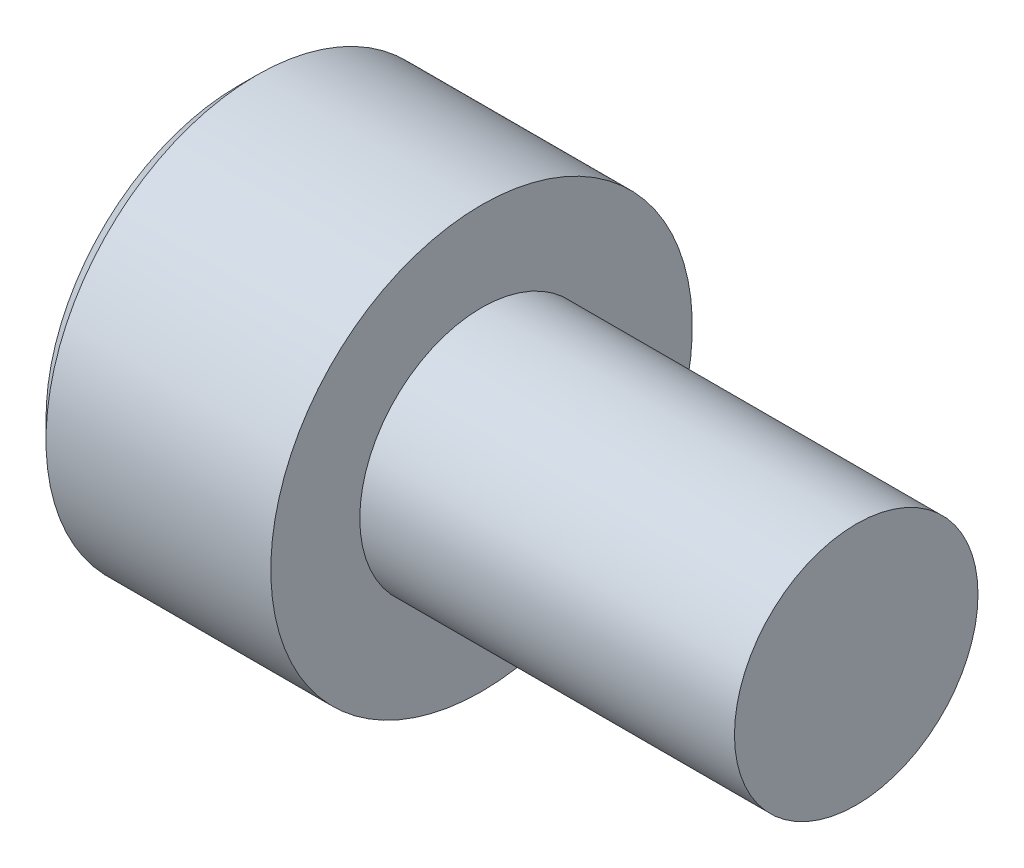
ISO-10303-21;
HEADER;
FILE_DESCRIPTION(('STEP AP214'),'2;1');
FILE_NAME('part.step','',(''),(''),'','','');
FILE_SCHEMA(('AUTOMOTIVE_DESIGN { 1 0 10303 214 1 1 1 1 }'));
ENDSEC;
DATA;
#1=APPLICATION_CONTEXT('core data for automotive mechanical design processes');
#2=APPLICATION_PROTOCOL_DEFINITION('international standard','automotive_design',2000,#1);
#3=PRODUCT_CONTEXT('',#1,'mechanical');
#4=PRODUCT('Part','Part','',(#3));
#5=PRODUCT_RELATED_PRODUCT_CATEGORY('part','',(#4));
#6=PRODUCT_DEFINITION_FORMATION('','',#4);
#7=PRODUCT_DEFINITION_CONTEXT('part definition',#1,'design');
#8=PRODUCT_DEFINITION('design','',#6,#7);
#9=PRODUCT_DEFINITION_SHAPE('','',#8);
#10=(LENGTH_UNIT() NAMED_UNIT(*) SI_UNIT(.MILLI.,.METRE.));
#11=(NAMED_UNIT(*) PLANE_ANGLE_UNIT() SI_UNIT($,.RADIAN.));
#12=(NAMED_UNIT(*) SI_UNIT($,.STERADIAN.) SOLID_ANGLE_UNIT());
#13=UNCERTAINTY_MEASURE_WITH_UNIT(LENGTH_MEASURE(1.E-05),#10,'distance_accuracy_value','');
#14=(GEOMETRIC_REPRESENTATION_CONTEXT(3) GLOBAL_UNCERTAINTY_ASSIGNED_CONTEXT((#13)) GLOBAL_UNIT_ASSIGNED_CONTEXT((#10,
#11,#12)) REPRESENTATION_CONTEXT('',''));
#15=CARTESIAN_POINT('',(0.,0.,0.));
#16=DIRECTION('',(0.,0.,1.));
#17=DIRECTION('',(1.,0.,0.));
#18=AXIS2_PLACEMENT_3D('',#15,#16,#17);
#19=CARTESIAN_POINT('',(-2.6,0.,0.));
#20=DIRECTION('',(1.,0.,0.));
#21=DIRECTION('',(0.,1.,0.));
#22=AXIS2_PLACEMENT_3D('',#19,#20,#21);
#23=PLANE('',#22);
#24=CARTESIAN_POINT('',(-2.6,0.,0.));
#25=DIRECTION('',(1.,0.,0.));
#26=DIRECTION('',(0.,1.,0.));
#27=AXIS2_PLACEMENT_3D('',#24,#25,#26);
#28=CIRCLE('',#27,2.05);
#29=CARTESIAN_POINT('',(-2.6,2.05,0.));
#30=VERTEX_POINT('',#29);
#31=EDGE_CURVE('E53',#30,#30,#28,.F.);
#32=ORIENTED_EDGE('',*,*,#31,.T.);
#33=EDGE_LOOP('',(#32));
#34=FACE_BOUND('',#33,.T.);
#35=DIRECTION('',(0.,0.5,-0.866025403784439));
#36=VECTOR('',#35,1.);
#37=CARTESIAN_POINT('',(-2.6,0.577350269189626,1.));
#38=LINE('',#37,#36);
#39=CARTESIAN_POINT('',(-2.6,0.577350269189626,1.));
#40=VERTEX_POINT('',#39);
#41=CARTESIAN_POINT('',(-2.6,1.15470053837925,0.));
#42=VERTEX_POINT('',#41);
#43=EDGE_CURVE('E189',#40,#42,#38,.T.);
#44=ORIENTED_EDGE('',*,*,#43,.F.);
#45=DIRECTION('',(0.,1.,0.));
#46=VECTOR('',#45,1.);
#47=CARTESIAN_POINT('',(-2.6,-0.577350269189626,1.));
#48=LINE('',#47,#46);
#49=CARTESIAN_POINT('',(-2.6,-0.577350269189626,1.));
#50=VERTEX_POINT('',#49);
#51=EDGE_CURVE('E151',#50,#40,#48,.T.);
#52=ORIENTED_EDGE('',*,*,#51,.F.);
#53=DIRECTION('',(0.,0.5,0.866025403784439));
#54=VECTOR('',#53,1.);
#55=CARTESIAN_POINT('',(-2.6,-1.15470053837925,0.));
#56=LINE('',#55,#54);
#57=CARTESIAN_POINT('',(-2.6,-1.15470053837925,0.));
#58=VERTEX_POINT('',#57);
#59=EDGE_CURVE('E147',#58,#50,#56,.T.);
#60=ORIENTED_EDGE('',*,*,#59,.F.);
#61=DIRECTION('',(0.,-0.5,0.866025403784439));
#62=VECTOR('',#61,1.);
#63=CARTESIAN_POINT('',(-2.6,-0.577350269189626,-1.));
#64=LINE('',#63,#62);
#65=CARTESIAN_POINT('',(-2.6,-0.577350269189626,-1.));
#66=VERTEX_POINT('',#65);
#67=EDGE_CURVE('E198',#66,#58,#64,.T.);
#68=ORIENTED_EDGE('',*,*,#67,.F.);
#69=DIRECTION('',(0.,-1.,0.));
#70=VECTOR('',#69,1.);
#71=CARTESIAN_POINT('',(-2.6,0.577350269189626,-1.));
#72=LINE('',#71,#70);
#73=CARTESIAN_POINT('',(-2.6,0.577350269189626,-1.));
#74=VERTEX_POINT('',#73);
#75=EDGE_CURVE('E195',#74,#66,#72,.T.);
#76=ORIENTED_EDGE('',*,*,#75,.F.);
#77=DIRECTION('',(0.,-0.5,-0.866025403784439));
#78=VECTOR('',#77,1.);
#79=CARTESIAN_POINT('',(-2.6,1.15470053837925,0.));
#80=LINE('',#79,#78);
#81=EDGE_CURVE('E192',#42,#74,#80,.T.);
#82=ORIENTED_EDGE('',*,*,#81,.F.);
#83=EDGE_LOOP('',(#44,#52,#60,#68,#76,#82));
#84=FACE_BOUND('',#83,.T.);
#85=ADVANCED_FACE('F44',(#34,#84),#23,.F.);
#86=CARTESIAN_POINT('',(0.,1.3,0.));
#87=DIRECTION('',(-1.,0.,0.));
#88=DIRECTION('',(0.,-1.,0.));
#89=AXIS2_PLACEMENT_3D('',#86,#87,#88);
#90=PLANE('',#89);
#91=CARTESIAN_POINT('',(0.,0.,0.));
#92=DIRECTION('',(-1.,0.,0.));
#93=DIRECTION('',(0.,-1.,0.));
#94=AXIS2_PLACEMENT_3D('',#91,#92,#93);
#95=CIRCLE('',#94,2.25);
#96=CARTESIAN_POINT('',(0.,-2.25,0.));
#97=VERTEX_POINT('',#96);
#98=EDGE_CURVE('E233',#97,#97,#95,.T.);
#99=ORIENTED_EDGE('',*,*,#98,.F.);
#100=EDGE_LOOP('',(#99));
#101=FACE_BOUND('',#100,.T.);
#102=CARTESIAN_POINT('',(0.,0.,0.));
#103=DIRECTION('',(-1.,0.,0.));
#104=DIRECTION('',(0.,-1.,0.));
#105=AXIS2_PLACEMENT_3D('',#102,#103,#104);
#106=CIRCLE('',#105,1.3);
#107=CARTESIAN_POINT('',(0.,-1.3,0.));
#108=VERTEX_POINT('',#107);
#109=EDGE_CURVE('E226',#108,#108,#106,.T.);
#110=ORIENTED_EDGE('',*,*,#109,.T.);
#111=EDGE_LOOP('',(#110));
#112=FACE_BOUND('',#111,.T.);
#113=ADVANCED_FACE('F254',(#101,#112),#90,.F.);
#114=CARTESIAN_POINT('',(-2.6,0.,0.));
#115=DIRECTION('',(-1.,0.,0.));
#116=DIRECTION('',(0.,-1.,0.));
#117=AXIS2_PLACEMENT_3D('',#114,#115,#116);
#118=CYLINDRICAL_SURFACE('',#117,2.25);
#119=CARTESIAN_POINT('',(-2.4,0.,0.));
#120=DIRECTION('',(1.,0.,0.));
#121=DIRECTION('',(0.,1.,0.));
#122=AXIS2_PLACEMENT_3D('',#119,#120,#121);
#123=CIRCLE('',#122,2.25);
#124=CARTESIAN_POINT('',(-2.4,2.25,0.));
#125=VERTEX_POINT('',#124);
#126=EDGE_CURVE('E11',#125,#125,#123,.T.);
#127=ORIENTED_EDGE('',*,*,#126,.T.);
#128=EDGE_LOOP('',(#127));
#129=FACE_BOUND('',#128,.T.);
#130=ORIENTED_EDGE('',*,*,#98,.T.);
#131=EDGE_LOOP('',(#130));
#132=FACE_BOUND('',#131,.T.);
#133=ADVANCED_FACE('F259',(#129,#132),#118,.T.);
#134=CARTESIAN_POINT('',(4.,1.3,0.));
#135=DIRECTION('',(-1.,0.,0.));
#136=DIRECTION('',(0.,-1.,0.));
#137=AXIS2_PLACEMENT_3D('',#134,#135,#136);
#138=PLANE('',#137);
#139=CARTESIAN_POINT('',(4.,0.,0.));
#140=DIRECTION('',(-1.,0.,0.));
#141=DIRECTION('',(0.,-1.,0.));
#142=AXIS2_PLACEMENT_3D('',#139,#140,#141);
#143=CIRCLE('',#142,1.3);
#144=CARTESIAN_POINT('',(4.,-1.3,0.));
#145=VERTEX_POINT('',#144);
#146=EDGE_CURVE('E229',#145,#145,#143,.T.);
#147=ORIENTED_EDGE('',*,*,#146,.F.);
#148=EDGE_LOOP('',(#147));
#149=FACE_BOUND('',#148,.T.);
#150=ADVANCED_FACE('F263',(#149),#138,.F.);
#151=CARTESIAN_POINT('',(-2.6,0.,0.));
#152=DIRECTION('',(-1.,0.,0.));
#153=DIRECTION('',(0.,-1.,0.));
#154=AXIS2_PLACEMENT_3D('',#151,#152,#153);
#155=CYLINDRICAL_SURFACE('',#154,1.3);
#156=ORIENTED_EDGE('',*,*,#109,.F.);
#157=EDGE_LOOP('',(#156));
#158=FACE_BOUND('',#157,.T.);
#159=ORIENTED_EDGE('',*,*,#146,.T.);
#160=EDGE_LOOP('',(#159));
#161=FACE_BOUND('',#160,.T.);
#162=ADVANCED_FACE('F270',(#158,#161),#155,.T.);
#163=CARTESIAN_POINT('',(-1.5,-0.577350269189626,1.));
#164=DIRECTION('',(0.,0.,1.));
#165=DIRECTION('',(0.,-1.,0.));
#166=AXIS2_PLACEMENT_3D('',#163,#164,#165);
#167=PLANE('',#166);
#168=DIRECTION('',(0.,1.,0.));
#169=VECTOR('',#168,1.);
#170=CARTESIAN_POINT('',(-1.5,-0.577350269189626,1.));
#171=LINE('',#170,#169);
#172=CARTESIAN_POINT('',(-1.5,-0.577350269189626,1.));
#173=VERTEX_POINT('',#172);
#174=CARTESIAN_POINT('',(-1.5,0.,1.));
#175=VERTEX_POINT('',#174);
#176=EDGE_CURVE('E74',#173,#175,#171,.T.);
#177=ORIENTED_EDGE('',*,*,#176,.F.);
#178=DIRECTION('',(-1.,0.,0.));
#179=VECTOR('',#178,1.);
#180=CARTESIAN_POINT('',(-1.5,-0.577350269189626,1.));
#181=LINE('',#180,#179);
#182=EDGE_CURVE('E204',#173,#50,#181,.T.);
#183=ORIENTED_EDGE('',*,*,#182,.T.);
#184=ORIENTED_EDGE('',*,*,#51,.T.);
#185=DIRECTION('',(-1.,0.,0.));
#186=VECTOR('',#185,1.);
#187=CARTESIAN_POINT('',(-1.5,0.577350269189626,1.));
#188=LINE('',#187,#186);
#189=CARTESIAN_POINT('',(-1.5,0.577350269189626,1.));
#190=VERTEX_POINT('',#189);
#191=EDGE_CURVE('E63',#190,#40,#188,.T.);
#192=ORIENTED_EDGE('',*,*,#191,.F.);
#193=EDGE_CURVE('E139',#175,#190,#171,.T.);
#194=ORIENTED_EDGE('',*,*,#193,.F.);
#195=EDGE_LOOP('',(#177,#183,#184,#192,#194));
#196=FACE_BOUND('',#195,.T.);
#197=ADVANCED_FACE('F149',(#196),#167,.F.);
#198=CARTESIAN_POINT('',(-1.5,-1.15470053837925,0.));
#199=DIRECTION('',(0.,-0.866025403784439,0.5));
#200=DIRECTION('',(0.,-0.5,-0.866025403784439));
#201=AXIS2_PLACEMENT_3D('',#198,#199,#200);
#202=PLANE('',#201);
#203=DIRECTION('',(0.,0.5,0.866025403784439));
#204=VECTOR('',#203,1.);
#205=CARTESIAN_POINT('',(-1.5,-1.15470053837925,0.));
#206=LINE('',#205,#204);
#207=CARTESIAN_POINT('',(-1.5,-1.15470053837925,0.));
#208=VERTEX_POINT('',#207);
#209=CARTESIAN_POINT('',(-1.5,-0.866025403784439,0.5));
#210=VERTEX_POINT('',#209);
#211=EDGE_CURVE('E155',#208,#210,#206,.T.);
#212=ORIENTED_EDGE('',*,*,#211,.F.);
#213=DIRECTION('',(-1.,0.,0.));
#214=VECTOR('',#213,1.);
#215=CARTESIAN_POINT('',(-1.5,-1.15470053837925,0.));
#216=LINE('',#215,#214);
#217=EDGE_CURVE('E208',#208,#58,#216,.T.);
#218=ORIENTED_EDGE('',*,*,#217,.T.);
#219=ORIENTED_EDGE('',*,*,#59,.T.);
#220=ORIENTED_EDGE('',*,*,#182,.F.);
#221=EDGE_CURVE('E183',#210,#173,#206,.T.);
#222=ORIENTED_EDGE('',*,*,#221,.F.);
#223=EDGE_LOOP('',(#212,#218,#219,#220,#222));
#224=FACE_BOUND('',#223,.T.);
#225=ADVANCED_FACE('F283',(#224),#202,.F.);
#226=CARTESIAN_POINT('',(-1.5,-0.577350269189626,-1.));
#227=DIRECTION('',(0.,-0.866025403784439,-0.5));
#228=DIRECTION('',(0.,0.5,-0.866025403784439));
#229=AXIS2_PLACEMENT_3D('',#226,#227,#228);
#230=PLANE('',#229);
#231=DIRECTION('',(0.,-0.5,0.866025403784439));
#232=VECTOR('',#231,1.);
#233=CARTESIAN_POINT('',(-1.5,-0.577350269189626,-1.));
#234=LINE('',#233,#232);
#235=CARTESIAN_POINT('',(-1.5,-0.577350269189626,-1.));
#236=VERTEX_POINT('',#235);
#237=CARTESIAN_POINT('',(-1.5,-0.866025403784439,-0.5));
#238=VERTEX_POINT('',#237);
#239=EDGE_CURVE('E179',#236,#238,#234,.T.);
#240=ORIENTED_EDGE('',*,*,#239,.F.);
#241=DIRECTION('',(-1.,0.,0.));
#242=VECTOR('',#241,1.);
#243=CARTESIAN_POINT('',(-1.5,-0.577350269189626,-1.));
#244=LINE('',#243,#242);
#245=EDGE_CURVE('E212',#236,#66,#244,.T.);
#246=ORIENTED_EDGE('',*,*,#245,.T.);
#247=ORIENTED_EDGE('',*,*,#67,.T.);
#248=ORIENTED_EDGE('',*,*,#217,.F.);
#249=EDGE_CURVE('E178',#238,#208,#234,.T.);
#250=ORIENTED_EDGE('',*,*,#249,.F.);
#251=EDGE_LOOP('',(#240,#246,#247,#248,#250));
#252=FACE_BOUND('',#251,.T.);
#253=ADVANCED_FACE('F295',(#252),#230,.F.);
#254=CARTESIAN_POINT('',(-1.5,0.577350269189626,-1.));
#255=DIRECTION('',(0.,0.,-1.));
#256=DIRECTION('',(-1.,0.,0.));
#257=AXIS2_PLACEMENT_3D('',#254,#255,#256);
#258=PLANE('',#257);
#259=DIRECTION('',(0.,-1.,0.));
#260=VECTOR('',#259,1.);
#261=CARTESIAN_POINT('',(-1.5,0.577350269189626,-1.));
#262=LINE('',#261,#260);
#263=CARTESIAN_POINT('',(-1.5,0.577350269189626,-1.));
#264=VERTEX_POINT('',#263);
#265=CARTESIAN_POINT('',(-1.5,0.,-1.));
#266=VERTEX_POINT('',#265);
#267=EDGE_CURVE('E174',#264,#266,#262,.T.);
#268=ORIENTED_EDGE('',*,*,#267,.F.);
#269=DIRECTION('',(-1.,0.,0.));
#270=VECTOR('',#269,1.);
#271=CARTESIAN_POINT('',(-1.5,0.577350269189626,-1.));
#272=LINE('',#271,#270);
#273=EDGE_CURVE('E216',#264,#74,#272,.T.);
#274=ORIENTED_EDGE('',*,*,#273,.T.);
#275=ORIENTED_EDGE('',*,*,#75,.T.);
#276=ORIENTED_EDGE('',*,*,#245,.F.);
#277=EDGE_CURVE('E173',#266,#236,#262,.T.);
#278=ORIENTED_EDGE('',*,*,#277,.F.);
#279=EDGE_LOOP('',(#268,#274,#275,#276,#278));
#280=FACE_BOUND('',#279,.T.);
#281=ADVANCED_FACE('F291',(#280),#258,.F.);
#282=CARTESIAN_POINT('',(-1.5,1.15470053837925,0.));
#283=DIRECTION('',(0.,0.866025403784439,-0.5));
#284=DIRECTION('',(0.,0.5,0.866025403784439));
#285=AXIS2_PLACEMENT_3D('',#282,#283,#284);
#286=PLANE('',#285);
#287=DIRECTION('',(0.,-0.5,-0.866025403784439));
#288=VECTOR('',#287,1.);
#289=CARTESIAN_POINT('',(-1.5,1.15470053837925,0.));
#290=LINE('',#289,#288);
#291=CARTESIAN_POINT('',(-1.5,1.15470053837925,0.));
#292=VERTEX_POINT('',#291);
#293=CARTESIAN_POINT('',(-1.5,0.866025403784439,-0.499999999999999));
#294=VERTEX_POINT('',#293);
#295=EDGE_CURVE('E167',#292,#294,#290,.T.);
#296=ORIENTED_EDGE('',*,*,#295,.F.);
#297=DIRECTION('',(-1.,0.,0.));
#298=VECTOR('',#297,1.);
#299=CARTESIAN_POINT('',(-1.5,1.15470053837925,0.));
#300=LINE('',#299,#298);
#301=EDGE_CURVE('E154',#292,#42,#300,.T.);
#302=ORIENTED_EDGE('',*,*,#301,.T.);
#303=ORIENTED_EDGE('',*,*,#81,.T.);
#304=ORIENTED_EDGE('',*,*,#273,.F.);
#305=EDGE_CURVE('E162',#294,#264,#290,.T.);
#306=ORIENTED_EDGE('',*,*,#305,.F.);
#307=EDGE_LOOP('',(#296,#302,#303,#304,#306));
#308=FACE_BOUND('',#307,.T.);
#309=ADVANCED_FACE('F288',(#308),#286,.F.);
#310=CARTESIAN_POINT('',(-1.5,0.577350269189626,1.));
#311=DIRECTION('',(0.,0.866025403784439,0.5));
#312=DIRECTION('',(0.,-0.5,0.866025403784439));
#313=AXIS2_PLACEMENT_3D('',#310,#311,#312);
#314=PLANE('',#313);
#315=DIRECTION('',(0.,0.5,-0.866025403784439));
#316=VECTOR('',#315,1.);
#317=CARTESIAN_POINT('',(-1.5,0.577350269189626,1.));
#318=LINE('',#317,#316);
#319=CARTESIAN_POINT('',(-1.5,0.866025403784439,0.5));
#320=VERTEX_POINT('',#319);
#321=EDGE_CURVE('E141',#190,#320,#318,.T.);
#322=ORIENTED_EDGE('',*,*,#321,.F.);
#323=ORIENTED_EDGE('',*,*,#191,.T.);
#324=ORIENTED_EDGE('',*,*,#43,.T.);
#325=ORIENTED_EDGE('',*,*,#301,.F.);
#326=EDGE_CURVE('E160',#320,#292,#318,.T.);
#327=ORIENTED_EDGE('',*,*,#326,.F.);
#328=EDGE_LOOP('',(#322,#323,#324,#325,#327));
#329=FACE_BOUND('',#328,.T.);
#330=ADVANCED_FACE('F158',(#329),#314,.F.);
#331=CARTESIAN_POINT('',(-1.5,0.,0.));
#332=DIRECTION('',(-1.,0.,0.));
#333=DIRECTION('',(0.,0.,1.));
#334=AXIS2_PLACEMENT_3D('',#331,#332,#333);
#335=PLANE('',#334);
#336=ORIENTED_EDGE('',*,*,#193,.T.);
#337=ORIENTED_EDGE('',*,*,#321,.T.);
#338=CARTESIAN_POINT('',(-1.5,0.,0.));
#339=DIRECTION('',(-1.,0.,0.));
#340=DIRECTION('',(0.,-1.,0.));
#341=AXIS2_PLACEMENT_3D('',#338,#339,#340);
#342=CIRCLE('',#341,1.);
#343=EDGE_CURVE('E143',#175,#320,#342,.T.);
#344=ORIENTED_EDGE('',*,*,#343,.F.);
#345=EDGE_LOOP('',(#336,#337,#344));
#346=FACE_BOUND('',#345,.T.);
#347=ADVANCED_FACE('F140',(#346),#335,.T.);
#348=ORIENTED_EDGE('',*,*,#326,.T.);
#349=ORIENTED_EDGE('',*,*,#295,.T.);
#350=EDGE_CURVE('E323',#320,#294,#342,.T.);
#351=ORIENTED_EDGE('',*,*,#350,.F.);
#352=EDGE_LOOP('',(#348,#349,#351));
#353=FACE_BOUND('',#352,.T.);
#354=ADVANCED_FACE('F311',(#353),#335,.T.);
#355=ORIENTED_EDGE('',*,*,#305,.T.);
#356=ORIENTED_EDGE('',*,*,#267,.T.);
#357=EDGE_CURVE('E329',#294,#266,#342,.T.);
#358=ORIENTED_EDGE('',*,*,#357,.F.);
#359=EDGE_LOOP('',(#355,#356,#358));
#360=FACE_BOUND('',#359,.T.);
#361=ADVANCED_FACE('F315',(#360),#335,.T.);
#362=ORIENTED_EDGE('',*,*,#277,.T.);
#363=ORIENTED_EDGE('',*,*,#239,.T.);
#364=EDGE_CURVE('E332',#266,#238,#342,.T.);
#365=ORIENTED_EDGE('',*,*,#364,.F.);
#366=EDGE_LOOP('',(#362,#363,#365));
#367=FACE_BOUND('',#366,.T.);
#368=ADVANCED_FACE('F308',(#367),#335,.T.);
#369=ORIENTED_EDGE('',*,*,#249,.T.);
#370=ORIENTED_EDGE('',*,*,#211,.T.);
#371=EDGE_CURVE('E207',#238,#210,#342,.T.);
#372=ORIENTED_EDGE('',*,*,#371,.F.);
#373=EDGE_LOOP('',(#369,#370,#372));
#374=FACE_BOUND('',#373,.T.);
#375=ADVANCED_FACE('F304',(#374),#335,.T.);
#376=ORIENTED_EDGE('',*,*,#221,.T.);
#377=ORIENTED_EDGE('',*,*,#176,.T.);
#378=EDGE_CURVE('E223',#210,#175,#342,.T.);
#379=ORIENTED_EDGE('',*,*,#378,.F.);
#380=EDGE_LOOP('',(#376,#377,#379));
#381=FACE_BOUND('',#380,.T.);
#382=ADVANCED_FACE('F249',(#381),#335,.T.);
#383=CARTESIAN_POINT('',(-0.899139380972433,0.,0.));
#384=DIRECTION('',(-1.,0.,0.));
#385=DIRECTION('',(0.,-1.,0.));
#386=AXIS2_PLACEMENT_3D('',#383,#384,#385);
#387=CONICAL_SURFACE('',#386,0.,1.02974425867665);
#388=ORIENTED_EDGE('',*,*,#378,.T.);
#389=ORIENTED_EDGE('',*,*,#343,.T.);
#390=ORIENTED_EDGE('',*,*,#350,.T.);
#391=ORIENTED_EDGE('',*,*,#357,.T.);
#392=ORIENTED_EDGE('',*,*,#364,.T.);
#393=ORIENTED_EDGE('',*,*,#371,.T.);
#394=EDGE_LOOP('',(#388,#389,#390,#391,#392,#393));
#395=FACE_BOUND('',#394,.T.);
#396=CARTESIAN_POINT('',(-0.899139380972433,0.,0.));
#397=VERTEX_POINT('',#396);
#398=VERTEX_LOOP('',#397);
#399=FACE_BOUND('',#398,.T.);
#400=ADVANCED_FACE('F244',(#395,#399),#387,.F.);
#401=CARTESIAN_POINT('',(-2.6,0.,0.));
#402=DIRECTION('',(1.,0.,0.));
#403=DIRECTION('',(0.,1.,0.));
#404=AXIS2_PLACEMENT_3D('',#401,#402,#403);
#405=CONICAL_SURFACE('',#404,2.05,0.785398163397446);
#406=CARTESIAN_POINT('',(-2.4,2.25,0.));
#407=CARTESIAN_POINT('',(-2.40208333333333,2.24791666666667,0.));
#408=CARTESIAN_POINT('',(-2.40416666666667,2.24583333333333,0.));
#409=CARTESIAN_POINT('',(-2.40833333333333,2.24166666666667,0.));
#410=CARTESIAN_POINT('',(-2.41041666666667,2.23958333333333,0.));
#411=CARTESIAN_POINT('',(-2.41458333333333,2.23541666666667,0.));
#412=CARTESIAN_POINT('',(-2.41666666666667,2.23333333333333,0.));
#413=CARTESIAN_POINT('',(-2.42083333333333,2.22916666666667,0.));
#414=CARTESIAN_POINT('',(-2.42291666666667,2.22708333333333,0.));
#415=CARTESIAN_POINT('',(-2.42708333333333,2.22291666666667,0.));
#416=CARTESIAN_POINT('',(-2.42916666666667,2.22083333333333,0.));
#417=CARTESIAN_POINT('',(-2.43333333333333,2.21666666666667,0.));
#418=CARTESIAN_POINT('',(-2.43541666666667,2.21458333333333,0.));
#419=CARTESIAN_POINT('',(-2.43958333333333,2.21041666666667,0.));
#420=CARTESIAN_POINT('',(-2.44166666666667,2.20833333333333,0.));
#421=CARTESIAN_POINT('',(-2.44583333333333,2.20416666666667,0.));
#422=CARTESIAN_POINT('',(-2.44791666666667,2.20208333333333,0.));
#423=CARTESIAN_POINT('',(-2.45208333333333,2.19791666666667,0.));
#424=CARTESIAN_POINT('',(-2.45416666666667,2.19583333333333,0.));
#425=CARTESIAN_POINT('',(-2.45833333333333,2.19166666666667,0.));
#426=CARTESIAN_POINT('',(-2.46041666666667,2.18958333333333,0.));
#427=CARTESIAN_POINT('',(-2.46458333333333,2.18541666666667,0.));
#428=CARTESIAN_POINT('',(-2.46666666666667,2.18333333333333,0.));
#429=CARTESIAN_POINT('',(-2.47083333333333,2.17916666666667,0.));
#430=CARTESIAN_POINT('',(-2.47291666666667,2.17708333333333,0.));
#431=CARTESIAN_POINT('',(-2.47708333333333,2.17291666666667,0.));
#432=CARTESIAN_POINT('',(-2.47916666666667,2.17083333333333,0.));
#433=CARTESIAN_POINT('',(-2.48333333333333,2.16666666666667,0.));
#434=CARTESIAN_POINT('',(-2.48541666666667,2.16458333333333,0.));
#435=CARTESIAN_POINT('',(-2.48958333333333,2.16041666666667,0.));
#436=CARTESIAN_POINT('',(-2.49166666666667,2.15833333333333,0.));
#437=CARTESIAN_POINT('',(-2.49583333333333,2.15416666666667,0.));
#438=CARTESIAN_POINT('',(-2.49791666666667,2.15208333333333,0.));
#439=CARTESIAN_POINT('',(-2.50208333333333,2.14791666666667,0.));
#440=CARTESIAN_POINT('',(-2.50416666666667,2.14583333333333,0.));
#441=CARTESIAN_POINT('',(-2.50833333333333,2.14166666666667,0.));
#442=CARTESIAN_POINT('',(-2.51041666666667,2.13958333333333,0.));
#443=CARTESIAN_POINT('',(-2.51458333333333,2.13541666666667,0.));
#444=CARTESIAN_POINT('',(-2.51666666666667,2.13333333333333,0.));
#445=CARTESIAN_POINT('',(-2.52083333333333,2.12916666666667,0.));
#446=CARTESIAN_POINT('',(-2.52291666666667,2.12708333333333,0.));
#447=CARTESIAN_POINT('',(-2.52708333333333,2.12291666666667,0.));
#448=CARTESIAN_POINT('',(-2.52916666666667,2.12083333333333,0.));
#449=CARTESIAN_POINT('',(-2.53333333333333,2.11666666666667,0.));
#450=CARTESIAN_POINT('',(-2.53541666666667,2.11458333333333,0.));
#451=CARTESIAN_POINT('',(-2.53958333333333,2.11041666666667,0.));
#452=CARTESIAN_POINT('',(-2.54166666666667,2.10833333333333,0.));
#453=CARTESIAN_POINT('',(-2.54583333333333,2.10416666666667,0.));
#454=CARTESIAN_POINT('',(-2.54791666666667,2.10208333333333,0.));
#455=CARTESIAN_POINT('',(-2.55208333333333,2.09791666666667,0.));
#456=CARTESIAN_POINT('',(-2.55416666666667,2.09583333333333,0.));
#457=CARTESIAN_POINT('',(-2.55833333333333,2.09166666666667,0.));
#458=CARTESIAN_POINT('',(-2.56041666666667,2.08958333333333,0.));
#459=CARTESIAN_POINT('',(-2.56458333333333,2.08541666666667,0.));
#460=CARTESIAN_POINT('',(-2.56666666666667,2.08333333333333,0.));
#461=CARTESIAN_POINT('',(-2.57083333333333,2.07916666666667,0.));
#462=CARTESIAN_POINT('',(-2.57291666666667,2.07708333333333,0.));
#463=CARTESIAN_POINT('',(-2.57708333333333,2.07291666666667,0.));
#464=CARTESIAN_POINT('',(-2.57916666666667,2.07083333333333,0.));
#465=CARTESIAN_POINT('',(-2.58333333333333,2.06666666666667,0.));
#466=CARTESIAN_POINT('',(-2.58541666666667,2.06458333333333,0.));
#467=CARTESIAN_POINT('',(-2.58958333333333,2.06041666666667,0.));
#468=CARTESIAN_POINT('',(-2.59166666666667,2.05833333333333,0.));
#469=CARTESIAN_POINT('',(-2.59583333333333,2.05416666666667,0.));
#470=CARTESIAN_POINT('',(-2.59791666666667,2.05208333333333,0.));
#471=CARTESIAN_POINT('',(-2.6,2.05,0.));
#472=B_SPLINE_CURVE_WITH_KNOTS('',3,(#406,#407,#408,#409,#410,#411,#412,#413,#414,#415,#416,
#417,#418,#419,#420,#421,#422,#423,#424,#425,#426,#427,#428,#429,#430,#431,#432,#433,#434,#435,
#436,#437,#438,#439,#440,#441,#442,#443,#444,#445,#446,#447,#448,#449,#450,#451,#452,#453,#454,
#455,#456,#457,#458,#459,#460,#461,#462,#463,#464,#465,#466,#467,#468,#469,#470,#471),
.UNSPECIFIED.,.F.,.F.,(4,2,2,2,2,2,2,2,2,2,2,2,2,2,2,2,2,2,2,2,2,2,2,2,2,2,2,2,2,2,2,2,4),(0.,
0.0088388347648321,0.0176776695296639,0.0265165042944957,0.0353553390593275,0.0441941738241593,
0.053033008588991,0.0618718433538228,0.0707106781186546,0.0795495128834867,0.0883883476483182,
0.0972271824131503,0.106066017177982,0.114904851942814,0.123743686707645,0.132582521472477,
0.141421356237309,0.150260191002141,0.159099025766973,0.167937860531805,0.176776695296636,
0.185615530061468,0.1944543648263,0.203293199591132,0.212132034355964,0.220970869120796,
0.229809703885628,0.238648538650459,0.247487373415291,0.256326208180123,0.265165042944955,
0.274003877709787,0.282842712474619),.UNSPECIFIED.);
#473=EDGE_CURVE('BSEAM46',#125,#30,#472,.T.);
#474=ORIENTED_EDGE('',*,*,#126,.F.);
#475=ORIENTED_EDGE('',*,*,#31,.F.);
#476=ORIENTED_EDGE('',*,*,#473,.T.);
#477=ORIENTED_EDGE('',*,*,#473,.F.);
#478=EDGE_LOOP('',(#474,#476,#475,#477));
#479=FACE_BOUND('',#478,.T.);
#480=ADVANCED_FACE('F46',(#479),#405,.T.);
#481=CLOSED_SHELL('',(#85,#113,#133,#150,#162,#197,#225,#253,#281,#309,#330,#347,#354,#361,#368,
#375,#382,#400,#480));
#482=MANIFOLD_SOLID_BREP('B2',#481);
#483=ADVANCED_BREP_SHAPE_REPRESENTATION('',(#18,#482),#14);
#484=SHAPE_DEFINITION_REPRESENTATION(#9,#483);
ENDSEC;
END-ISO-10303-21;
